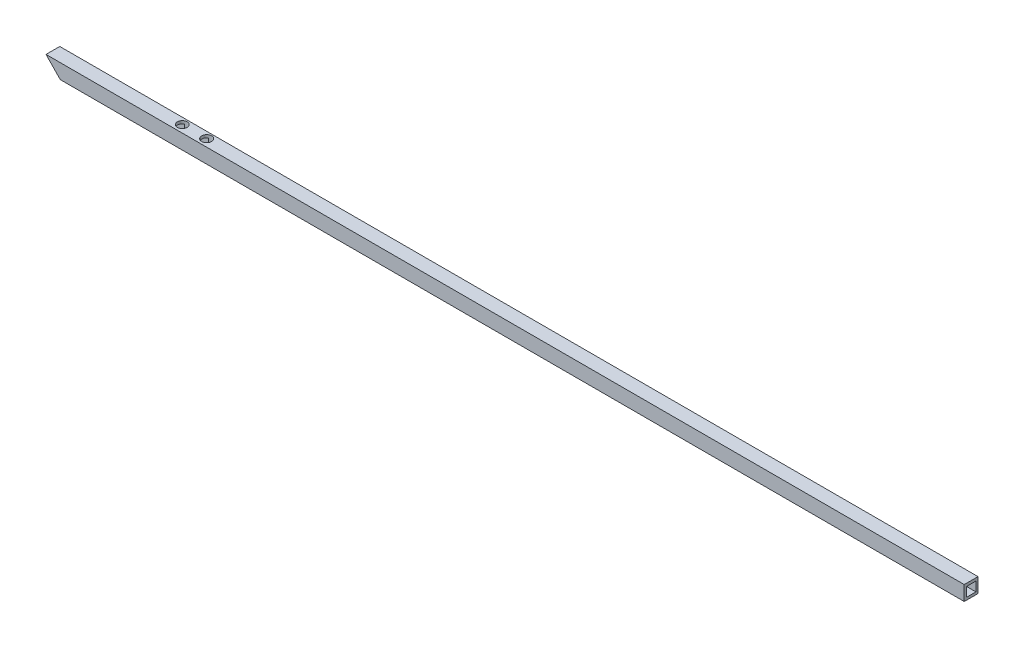
ISO-10303-21;
HEADER;
FILE_DESCRIPTION(('STEP AP214'),'2;1');
FILE_NAME('part.step','',(''),(''),'','','');
FILE_SCHEMA(('AUTOMOTIVE_DESIGN { 1 0 10303 214 1 1 1 1 }'));
ENDSEC;
DATA;
#1=APPLICATION_CONTEXT('core data for automotive mechanical design processes');
#2=APPLICATION_PROTOCOL_DEFINITION('international standard','automotive_design',2000,#1);
#3=PRODUCT_CONTEXT('',#1,'mechanical');
#4=PRODUCT('Part','Part','',(#3));
#5=PRODUCT_RELATED_PRODUCT_CATEGORY('part','',(#4));
#6=PRODUCT_DEFINITION_FORMATION('','',#4);
#7=PRODUCT_DEFINITION_CONTEXT('part definition',#1,'design');
#8=PRODUCT_DEFINITION('design','',#6,#7);
#9=PRODUCT_DEFINITION_SHAPE('','',#8);
#10=(LENGTH_UNIT() NAMED_UNIT(*) SI_UNIT(.MILLI.,.METRE.));
#11=(NAMED_UNIT(*) PLANE_ANGLE_UNIT() SI_UNIT($,.RADIAN.));
#12=(NAMED_UNIT(*) SI_UNIT($,.STERADIAN.) SOLID_ANGLE_UNIT());
#13=UNCERTAINTY_MEASURE_WITH_UNIT(LENGTH_MEASURE(1.E-05),#10,'distance_accuracy_value','');
#14=(GEOMETRIC_REPRESENTATION_CONTEXT(3) GLOBAL_UNCERTAINTY_ASSIGNED_CONTEXT((#13)) GLOBAL_UNIT_ASSIGNED_CONTEXT((#10,
#11,#12)) REPRESENTATION_CONTEXT('',''));
#15=CARTESIAN_POINT('',(0.,0.,0.));
#16=DIRECTION('',(0.,0.,1.));
#17=DIRECTION('',(1.,0.,0.));
#18=AXIS2_PLACEMENT_3D('',#15,#16,#17);
#19=CARTESIAN_POINT('',(-62.0552645668274,-8.14546996003816,7.62));
#20=DIRECTION('',(0.717580691628316,0.696475377168661,0.));
#21=DIRECTION('',(-0.696475377168661,0.717580691628316,0.));
#22=AXIS2_PLACEMENT_3D('',#19,#20,#21);
#23=PLANE('',#22);
#24=DIRECTION('',(0.,0.,1.));
#25=VECTOR('',#24,1.);
#26=CARTESIAN_POINT('',(-68.4516754726767,-1.55522842067826,7.62));
#27=LINE('',#26,#25);
#28=CARTESIAN_POINT('',(-68.4516754726767,-1.55522842067826,1.16287923693833));
#29=VERTEX_POINT('',#28);
#30=CARTESIAN_POINT('',(-68.4516754726767,-1.55522842067826,6.32744096741976));
#31=VERTEX_POINT('',#30);
#32=EDGE_CURVE('E247',#29,#31,#27,.T.);
#33=ORIENTED_EDGE('',*,*,#32,.T.);
#34=DIRECTION('',(0.696475377168661,-0.717580691628316,0.));
#35=VECTOR('',#34,1.);
#36=CARTESIAN_POINT('',(-62.0552645668274,-8.14546996003816,6.32744096741976));
#37=LINE('',#36,#35);
#38=CARTESIAN_POINT('',(-63.425501395985,-6.73371080272433,6.32744096741976));
#39=VERTEX_POINT('',#38);
#40=EDGE_CURVE('E251',#31,#39,#37,.T.);
#41=ORIENTED_EDGE('',*,*,#40,.T.);
#42=DIRECTION('',(0.,0.,-1.));
#43=VECTOR('',#42,1.);
#44=CARTESIAN_POINT('',(-63.425501395985,-6.73371080272433,7.62));
#45=LINE('',#44,#43);
#46=CARTESIAN_POINT('',(-63.425501395985,-6.73371080272433,1.16287923693833));
#47=VERTEX_POINT('',#46);
#48=EDGE_CURVE('E225',#39,#47,#45,.T.);
#49=ORIENTED_EDGE('',*,*,#48,.T.);
#50=DIRECTION('',(-0.696475377168661,0.717580691628316,0.));
#51=VECTOR('',#50,1.);
#52=CARTESIAN_POINT('',(-62.0552645668274,-8.14546996003816,1.16287923693833));
#53=LINE('',#52,#51);
#54=EDGE_CURVE('E243',#47,#29,#53,.T.);
#55=ORIENTED_EDGE('',*,*,#54,.T.);
#56=EDGE_LOOP('',(#33,#41,#49,#55));
#57=FACE_BOUND('',#56,.T.);
#58=DIRECTION('',(0.696475377168661,-0.717580691628315,0.));
#59=VECTOR('',#58,1.);
#60=CARTESIAN_POINT('',(-62.0552645668274,-8.14546996003816,0.));
#61=LINE('',#60,#59);
#62=CARTESIAN_POINT('',(-69.9611618809821,0.,0.));
#63=VERTEX_POINT('',#62);
#64=CARTESIAN_POINT('',(-62.0552645668274,-8.14546996003816,0.));
#65=VERTEX_POINT('',#64);
#66=EDGE_CURVE('E255',#63,#65,#61,.T.);
#67=ORIENTED_EDGE('',*,*,#66,.T.);
#68=DIRECTION('',(0.,0.,-1.));
#69=VECTOR('',#68,1.);
#70=CARTESIAN_POINT('',(-62.0552645668274,-8.14546996003816,7.62));
#71=LINE('',#70,#69);
#72=CARTESIAN_POINT('',(-62.0552645668274,-8.14546996003816,7.62));
#73=VERTEX_POINT('',#72);
#74=EDGE_CURVE('E293',#73,#65,#71,.T.);
#75=ORIENTED_EDGE('',*,*,#74,.F.);
#76=DIRECTION('',(0.696475377168661,-0.717580691628315,0.));
#77=VECTOR('',#76,1.);
#78=CARTESIAN_POINT('',(-62.0552645668274,-8.14546996003816,7.62));
#79=LINE('',#78,#77);
#80=CARTESIAN_POINT('',(-69.9611618809821,0.,7.62));
#81=VERTEX_POINT('',#80);
#82=EDGE_CURVE('E256',#81,#73,#79,.T.);
#83=ORIENTED_EDGE('',*,*,#82,.F.);
#84=DIRECTION('',(0.,0.,-1.));
#85=VECTOR('',#84,1.);
#86=CARTESIAN_POINT('',(-69.9611618809821,0.,7.62));
#87=LINE('',#86,#85);
#88=EDGE_CURVE('E270',#81,#63,#87,.T.);
#89=ORIENTED_EDGE('',*,*,#88,.T.);
#90=EDGE_LOOP('',(#67,#75,#83,#89));
#91=FACE_BOUND('',#90,.T.);
#92=ADVANCED_FACE('F38',(#57,#91),#23,.F.);
#93=CARTESIAN_POINT('',(438.038838119018,-8.1454699600381,7.62));
#94=DIRECTION('',(0.,1.,0.));
#95=DIRECTION('',(-1.,0.,0.));
#96=AXIS2_PLACEMENT_3D('',#93,#94,#95);
#97=PLANE('',#96);
#98=CARTESIAN_POINT('',(355.64213702936,-8.14546996003811,4.34554706149031));
#99=DIRECTION('',(0.,-1.,0.));
#100=DIRECTION('',(1.,0.,0.));
#101=AXIS2_PLACEMENT_3D('',#98,#99,#100);
#102=CIRCLE('',#101,2.27462414063635);
#103=CARTESIAN_POINT('',(357.916761169997,-8.14546996003811,4.34554706149031));
#104=VERTEX_POINT('',#103);
#105=EDGE_CURVE('E161',#104,#104,#102,.T.);
#106=ORIENTED_EDGE('',*,*,#105,.F.);
#107=EDGE_LOOP('',(#106));
#108=FACE_BOUND('',#107,.T.);
#109=CARTESIAN_POINT('',(368.018591586891,-8.14546996003811,4.34554706149031));
#110=DIRECTION('',(0.,-1.,0.));
#111=DIRECTION('',(1.,0.,0.));
#112=AXIS2_PLACEMENT_3D('',#109,#110,#111);
#113=CIRCLE('',#112,2.35533153052693);
#114=CARTESIAN_POINT('',(370.373923117418,-8.14546996003811,4.34554706149031));
#115=VERTEX_POINT('',#114);
#116=EDGE_CURVE('E162',#115,#115,#113,.T.);
#117=ORIENTED_EDGE('',*,*,#116,.F.);
#118=EDGE_LOOP('',(#117));
#119=FACE_BOUND('',#118,.T.);
#120=DIRECTION('',(1.,0.,0.));
#121=VECTOR('',#120,1.);
#122=CARTESIAN_POINT('',(438.038838119018,-8.1454699600381,0.));
#123=LINE('',#122,#121);
#124=CARTESIAN_POINT('',(438.038838119018,-8.1454699600381,0.));
#125=VERTEX_POINT('',#124);
#126=EDGE_CURVE('E274',#65,#125,#123,.T.);
#127=ORIENTED_EDGE('',*,*,#126,.T.);
#128=DIRECTION('',(0.,0.,-1.));
#129=VECTOR('',#128,1.);
#130=CARTESIAN_POINT('',(438.038838119018,-8.1454699600381,7.62));
#131=LINE('',#130,#129);
#132=CARTESIAN_POINT('',(438.038838119018,-8.1454699600381,7.62));
#133=VERTEX_POINT('',#132);
#134=EDGE_CURVE('E289',#133,#125,#131,.T.);
#135=ORIENTED_EDGE('',*,*,#134,.F.);
#136=DIRECTION('',(1.,0.,0.));
#137=VECTOR('',#136,1.);
#138=CARTESIAN_POINT('',(438.038838119018,-8.1454699600381,7.62));
#139=LINE('',#138,#137);
#140=EDGE_CURVE('E260',#73,#133,#139,.T.);
#141=ORIENTED_EDGE('',*,*,#140,.F.);
#142=ORIENTED_EDGE('',*,*,#74,.T.);
#143=EDGE_LOOP('',(#127,#135,#141,#142));
#144=FACE_BOUND('',#143,.T.);
#145=ADVANCED_FACE('F375',(#108,#119,#144),#97,.F.);
#146=CARTESIAN_POINT('',(438.038838119018,0.,7.62));
#147=DIRECTION('',(-1.,0.,0.));
#148=DIRECTION('',(0.,0.,1.));
#149=AXIS2_PLACEMENT_3D('',#146,#147,#148);
#150=PLANE('',#149);
#151=DIRECTION('',(0.,0.,-1.));
#152=VECTOR('',#151,1.);
#153=CARTESIAN_POINT('',(438.038838119018,-6.73371080272433,6.32744096741976));
#154=LINE('',#153,#152);
#155=CARTESIAN_POINT('',(438.038838119018,-6.73371080272433,6.32744096741976));
#156=VERTEX_POINT('',#155);
#157=CARTESIAN_POINT('',(438.038838119018,-6.73371080272433,1.16287923693833));
#158=VERTEX_POINT('',#157);
#159=EDGE_CURVE('E210',#156,#158,#154,.T.);
#160=ORIENTED_EDGE('',*,*,#159,.F.);
#161=DIRECTION('',(0.,-1.,0.));
#162=VECTOR('',#161,1.);
#163=CARTESIAN_POINT('',(438.038838119018,-1.55522842067826,6.32744096741976));
#164=LINE('',#163,#162);
#165=CARTESIAN_POINT('',(438.038838119018,-1.55522842067826,6.32744096741976));
#166=VERTEX_POINT('',#165);
#167=EDGE_CURVE('E207',#166,#156,#164,.T.);
#168=ORIENTED_EDGE('',*,*,#167,.F.);
#169=DIRECTION('',(0.,0.,1.));
#170=VECTOR('',#169,1.);
#171=CARTESIAN_POINT('',(438.038838119018,-1.55522842067826,6.32744096741976));
#172=LINE('',#171,#170);
#173=CARTESIAN_POINT('',(438.038838119018,-1.55522842067826,1.16287923693833));
#174=VERTEX_POINT('',#173);
#175=EDGE_CURVE('E218',#174,#166,#172,.T.);
#176=ORIENTED_EDGE('',*,*,#175,.F.);
#177=DIRECTION('',(0.,1.,0.));
#178=VECTOR('',#177,1.);
#179=CARTESIAN_POINT('',(438.038838119018,-1.55522842067826,1.16287923693833));
#180=LINE('',#179,#178);
#181=EDGE_CURVE('E214',#158,#174,#180,.T.);
#182=ORIENTED_EDGE('',*,*,#181,.F.);
#183=EDGE_LOOP('',(#160,#168,#176,#182));
#184=FACE_BOUND('',#183,.T.);
#185=DIRECTION('',(0.,1.,0.));
#186=VECTOR('',#185,1.);
#187=CARTESIAN_POINT('',(438.038838119018,0.,0.));
#188=LINE('',#187,#186);
#189=CARTESIAN_POINT('',(438.038838119018,0.,0.));
#190=VERTEX_POINT('',#189);
#191=EDGE_CURVE('E277',#125,#190,#188,.T.);
#192=ORIENTED_EDGE('',*,*,#191,.T.);
#193=DIRECTION('',(0.,0.,-1.));
#194=VECTOR('',#193,1.);
#195=CARTESIAN_POINT('',(438.038838119018,0.,7.62));
#196=LINE('',#195,#194);
#197=CARTESIAN_POINT('',(438.038838119018,0.,7.62));
#198=VERTEX_POINT('',#197);
#199=EDGE_CURVE('E285',#198,#190,#196,.T.);
#200=ORIENTED_EDGE('',*,*,#199,.F.);
#201=DIRECTION('',(0.,1.,0.));
#202=VECTOR('',#201,1.);
#203=CARTESIAN_POINT('',(438.038838119018,0.,7.62));
#204=LINE('',#203,#202);
#205=EDGE_CURVE('E264',#133,#198,#204,.T.);
#206=ORIENTED_EDGE('',*,*,#205,.F.);
#207=ORIENTED_EDGE('',*,*,#134,.T.);
#208=EDGE_LOOP('',(#192,#200,#206,#207));
#209=FACE_BOUND('',#208,.T.);
#210=ADVANCED_FACE('F336',(#184,#209),#150,.F.);
#211=CARTESIAN_POINT('',(-69.9611618809821,0.,7.62));
#212=DIRECTION('',(0.,-1.,0.));
#213=DIRECTION('',(0.,0.,-1.));
#214=AXIS2_PLACEMENT_3D('',#211,#212,#213);
#215=PLANE('',#214);
#216=CARTESIAN_POINT('',(1.36748307861712,0.,3.54632385434046));
#217=DIRECTION('',(0.,1.,0.));
#218=DIRECTION('',(0.,0.,1.));
#219=AXIS2_PLACEMENT_3D('',#216,#217,#218);
#220=CIRCLE('',#219,2.69540727056071);
#221=CARTESIAN_POINT('',(1.36748307861712,0.,6.24173112490116));
#222=VERTEX_POINT('',#221);
#223=EDGE_CURVE('E190',#222,#222,#220,.T.);
#224=ORIENTED_EDGE('',*,*,#223,.F.);
#225=EDGE_LOOP('',(#224));
#226=FACE_BOUND('',#225,.T.);
#227=CARTESIAN_POINT('',(14.8575847480799,0.,3.54632385434046));
#228=DIRECTION('',(0.,1.,0.));
#229=DIRECTION('',(0.,0.,1.));
#230=AXIS2_PLACEMENT_3D('',#227,#228,#229);
#231=CIRCLE('',#230,2.7478456385973);
#232=CARTESIAN_POINT('',(14.8575847480799,0.,6.29416949293776));
#233=VERTEX_POINT('',#232);
#234=EDGE_CURVE('E185',#233,#233,#231,.T.);
#235=ORIENTED_EDGE('',*,*,#234,.F.);
#236=EDGE_LOOP('',(#235));
#237=FACE_BOUND('',#236,.T.);
#238=DIRECTION('',(-1.,0.,0.));
#239=VECTOR('',#238,1.);
#240=CARTESIAN_POINT('',(-69.9611618809821,0.,0.));
#241=LINE('',#240,#239);
#242=EDGE_CURVE('E261',#190,#63,#241,.T.);
#243=ORIENTED_EDGE('',*,*,#242,.T.);
#244=ORIENTED_EDGE('',*,*,#88,.F.);
#245=DIRECTION('',(-1.,0.,0.));
#246=VECTOR('',#245,1.);
#247=CARTESIAN_POINT('',(-69.9611618809821,0.,7.62));
#248=LINE('',#247,#246);
#249=EDGE_CURVE('E267',#198,#81,#248,.T.);
#250=ORIENTED_EDGE('',*,*,#249,.F.);
#251=ORIENTED_EDGE('',*,*,#199,.T.);
#252=EDGE_LOOP('',(#243,#244,#250,#251));
#253=FACE_BOUND('',#252,.T.);
#254=ADVANCED_FACE('F383',(#226,#237,#253),#215,.F.);
#255=CARTESIAN_POINT('',(0.,0.,7.62));
#256=DIRECTION('',(0.,0.,-1.));
#257=DIRECTION('',(-1.,0.,0.));
#258=AXIS2_PLACEMENT_3D('',#255,#256,#257);
#259=PLANE('',#258);
#260=ORIENTED_EDGE('',*,*,#82,.T.);
#261=ORIENTED_EDGE('',*,*,#140,.T.);
#262=ORIENTED_EDGE('',*,*,#205,.T.);
#263=ORIENTED_EDGE('',*,*,#249,.T.);
#264=EDGE_LOOP('',(#260,#261,#262,#263));
#265=FACE_BOUND('',#264,.T.);
#266=ADVANCED_FACE('F390',(#265),#259,.F.);
#267=CARTESIAN_POINT('',(0.,0.,0.));
#268=DIRECTION('',(0.,0.,-1.));
#269=DIRECTION('',(-1.,0.,0.));
#270=AXIS2_PLACEMENT_3D('',#267,#268,#269);
#271=PLANE('',#270);
#272=ORIENTED_EDGE('',*,*,#66,.F.);
#273=ORIENTED_EDGE('',*,*,#242,.F.);
#274=ORIENTED_EDGE('',*,*,#191,.F.);
#275=ORIENTED_EDGE('',*,*,#126,.F.);
#276=EDGE_LOOP('',(#272,#273,#274,#275));
#277=FACE_BOUND('',#276,.T.);
#278=ADVANCED_FACE('F392',(#277),#271,.T.);
#279=CARTESIAN_POINT('',(-69.9611618809821,-1.55522842067826,6.32744096741976));
#280=DIRECTION('',(0.,0.,1.));
#281=DIRECTION('',(1.,0.,0.));
#282=AXIS2_PLACEMENT_3D('',#279,#280,#281);
#283=PLANE('',#282);
#284=DIRECTION('',(1.,0.,0.));
#285=VECTOR('',#284,1.);
#286=CARTESIAN_POINT('',(-69.9611618809821,-3.06546996003816,6.32744096741976));
#287=LINE('',#286,#285);
#288=CARTESIAN_POINT('',(354.52588816517,-3.06546996003811,6.32744096741976));
#289=VERTEX_POINT('',#288);
#290=CARTESIAN_POINT('',(356.75838589355,-3.06546996003811,6.32744096741976));
#291=VERTEX_POINT('',#290);
#292=EDGE_CURVE('E11',#289,#291,#287,.T.);
#293=ORIENTED_EDGE('',*,*,#292,.F.);
#294=DIRECTION('',(0.,-1.,0.));
#295=VECTOR('',#294,1.);
#296=CARTESIAN_POINT('',(354.52588816517,-3.06546996003811,6.32744096741976));
#297=LINE('',#296,#295);
#298=CARTESIAN_POINT('',(354.52588816517,-6.73371080272433,6.32744096741976));
#299=VERTEX_POINT('',#298);
#300=EDGE_CURVE('E181',#289,#299,#297,.T.);
#301=ORIENTED_EDGE('',*,*,#300,.T.);
#302=DIRECTION('',(1.,0.,0.));
#303=VECTOR('',#302,1.);
#304=CARTESIAN_POINT('',(-69.9611618809821,-6.73371080272433,6.32744096741976));
#305=LINE('',#304,#303);
#306=EDGE_CURVE('E235',#39,#299,#305,.T.);
#307=ORIENTED_EDGE('',*,*,#306,.F.);
#308=ORIENTED_EDGE('',*,*,#40,.F.);
#309=DIRECTION('',(1.,0.,0.));
#310=VECTOR('',#309,1.);
#311=CARTESIAN_POINT('',(-69.9611618809821,-1.55522842067826,6.32744096741976));
#312=LINE('',#311,#310);
#313=EDGE_CURVE('E222',#31,#166,#312,.T.);
#314=ORIENTED_EDGE('',*,*,#313,.T.);
#315=ORIENTED_EDGE('',*,*,#167,.T.);
#316=CARTESIAN_POINT('',(369.291259322136,-6.73371080272433,6.32744096741976));
#317=VERTEX_POINT('',#316);
#318=EDGE_CURVE('E168',#317,#156,#305,.T.);
#319=ORIENTED_EDGE('',*,*,#318,.F.);
#320=DIRECTION('',(0.,-1.,0.));
#321=VECTOR('',#320,1.);
#322=CARTESIAN_POINT('',(369.291259322136,-3.06546996003811,6.32744096741976));
#323=LINE('',#322,#321);
#324=CARTESIAN_POINT('',(369.291259322136,-3.06546996003811,6.32744096741976));
#325=VERTEX_POINT('',#324);
#326=EDGE_CURVE('E53',#317,#325,#323,.F.);
#327=ORIENTED_EDGE('',*,*,#326,.T.);
#328=DIRECTION('',(1.,0.,0.));
#329=VECTOR('',#328,1.);
#330=CARTESIAN_POINT('',(-69.9611618809821,-3.06546996003816,6.32744096741976));
#331=LINE('',#330,#329);
#332=CARTESIAN_POINT('',(366.745923851646,-3.06546996003811,6.32744096741976));
#333=VERTEX_POINT('',#332);
#334=EDGE_CURVE('E46',#333,#325,#331,.T.);
#335=ORIENTED_EDGE('',*,*,#334,.F.);
#336=DIRECTION('',(0.,-1.,0.));
#337=VECTOR('',#336,1.);
#338=CARTESIAN_POINT('',(366.745923851646,-3.06546996003811,6.32744096741976));
#339=LINE('',#338,#337);
#340=CARTESIAN_POINT('',(366.745923851646,-6.73371080272433,6.32744096741976));
#341=VERTEX_POINT('',#340);
#342=EDGE_CURVE('E159',#333,#341,#339,.T.);
#343=ORIENTED_EDGE('',*,*,#342,.T.);
#344=CARTESIAN_POINT('',(356.75838589355,-6.73371080272433,6.32744096741976));
#345=VERTEX_POINT('',#344);
#346=EDGE_CURVE('E239',#345,#341,#305,.T.);
#347=ORIENTED_EDGE('',*,*,#346,.F.);
#348=DIRECTION('',(0.,-1.,0.));
#349=VECTOR('',#348,1.);
#350=CARTESIAN_POINT('',(356.75838589355,-3.06546996003811,6.32744096741976));
#351=LINE('',#350,#349);
#352=EDGE_CURVE('E61',#345,#291,#351,.F.);
#353=ORIENTED_EDGE('',*,*,#352,.T.);
#354=EDGE_LOOP('',(#293,#301,#307,#308,#314,#315,#319,#327,#335,#343,#347,#353));
#355=FACE_BOUND('',#354,.T.);
#356=ADVANCED_FACE('F166',(#355),#283,.F.);
#357=CARTESIAN_POINT('',(-69.9611618809821,-1.55522842067826,6.32744096741976));
#358=DIRECTION('',(0.,1.,0.));
#359=DIRECTION('',(0.,0.,1.));
#360=AXIS2_PLACEMENT_3D('',#357,#358,#359);
#361=PLANE('',#360);
#362=DIRECTION('',(1.,0.,0.));
#363=VECTOR('',#362,1.);
#364=CARTESIAN_POINT('',(-69.9611618809821,-1.55522842067826,1.16287923693833));
#365=LINE('',#364,#363);
#366=CARTESIAN_POINT('',(0.108748750028128,-1.55522842067826,1.16287923693833));
#367=VERTEX_POINT('',#366);
#368=EDGE_CURVE('E226',#29,#367,#365,.T.);
#369=ORIENTED_EDGE('',*,*,#368,.T.);
#370=CARTESIAN_POINT('',(1.36748307861712,-1.55522842067826,3.54632385434046));
#371=DIRECTION('',(0.,1.,0.));
#372=DIRECTION('',(0.,0.,1.));
#373=AXIS2_PLACEMENT_3D('',#370,#371,#372);
#374=CIRCLE('',#373,2.69540727056071);
#375=CARTESIAN_POINT('',(2.6262174072061,-1.55522842067826,1.16287923693833));
#376=VERTEX_POINT('',#375);
#377=EDGE_CURVE('E203',#367,#376,#374,.T.);
#378=ORIENTED_EDGE('',*,*,#377,.T.);
#379=CARTESIAN_POINT('',(13.4901611087732,-1.55522842067826,1.16287923693833));
#380=VERTEX_POINT('',#379);
#381=EDGE_CURVE('E230',#376,#380,#365,.T.);
#382=ORIENTED_EDGE('',*,*,#381,.T.);
#383=CARTESIAN_POINT('',(14.8575847480799,-1.55522842067826,3.54632385434046));
#384=DIRECTION('',(0.,1.,0.));
#385=DIRECTION('',(0.,0.,1.));
#386=AXIS2_PLACEMENT_3D('',#383,#384,#385);
#387=CIRCLE('',#386,2.7478456385973);
#388=CARTESIAN_POINT('',(16.2250083873867,-1.55522842067826,1.16287923693833));
#389=VERTEX_POINT('',#388);
#390=EDGE_CURVE('E189',#380,#389,#387,.T.);
#391=ORIENTED_EDGE('',*,*,#390,.T.);
#392=EDGE_CURVE('E231',#389,#174,#365,.T.);
#393=ORIENTED_EDGE('',*,*,#392,.T.);
#394=ORIENTED_EDGE('',*,*,#175,.T.);
#395=ORIENTED_EDGE('',*,*,#313,.F.);
#396=ORIENTED_EDGE('',*,*,#32,.F.);
#397=EDGE_LOOP('',(#369,#378,#382,#391,#393,#394,#395,#396));
#398=FACE_BOUND('',#397,.T.);
#399=ADVANCED_FACE('F347',(#398),#361,.F.);
#400=CARTESIAN_POINT('',(-69.9611618809821,-1.55522842067826,1.16287923693833));
#401=DIRECTION('',(0.,0.,-1.));
#402=DIRECTION('',(-1.,0.,0.));
#403=AXIS2_PLACEMENT_3D('',#400,#401,#402);
#404=PLANE('',#403);
#405=DIRECTION('',(1.,0.,0.));
#406=VECTOR('',#405,1.);
#407=CARTESIAN_POINT('',(-69.9611618809821,-5.08,1.16287923693833));
#408=LINE('',#407,#406);
#409=CARTESIAN_POINT('',(0.108748750028128,-5.08,1.16287923693833));
#410=VERTEX_POINT('',#409);
#411=CARTESIAN_POINT('',(2.6262174072061,-5.08,1.16287923693833));
#412=VERTEX_POINT('',#411);
#413=EDGE_CURVE('E308',#410,#412,#408,.T.);
#414=ORIENTED_EDGE('',*,*,#413,.F.);
#415=DIRECTION('',(0.,1.,0.));
#416=VECTOR('',#415,1.);
#417=CARTESIAN_POINT('',(0.108748750028128,-5.08,1.16287923693833));
#418=LINE('',#417,#416);
#419=EDGE_CURVE('E315',#410,#367,#418,.T.);
#420=ORIENTED_EDGE('',*,*,#419,.T.);
#421=ORIENTED_EDGE('',*,*,#368,.F.);
#422=ORIENTED_EDGE('',*,*,#54,.F.);
#423=DIRECTION('',(1.,0.,0.));
#424=VECTOR('',#423,1.);
#425=CARTESIAN_POINT('',(-69.9611618809821,-6.73371080272433,1.16287923693833));
#426=LINE('',#425,#424);
#427=EDGE_CURVE('E232',#47,#158,#426,.T.);
#428=ORIENTED_EDGE('',*,*,#427,.T.);
#429=ORIENTED_EDGE('',*,*,#181,.T.);
#430=ORIENTED_EDGE('',*,*,#392,.F.);
#431=DIRECTION('',(0.,1.,0.));
#432=VECTOR('',#431,1.);
#433=CARTESIAN_POINT('',(16.2250083873867,-5.08,1.16287923693833));
#434=LINE('',#433,#432);
#435=CARTESIAN_POINT('',(16.2250083873867,-5.08,1.16287923693833));
#436=VERTEX_POINT('',#435);
#437=EDGE_CURVE('E300',#389,#436,#434,.F.);
#438=ORIENTED_EDGE('',*,*,#437,.T.);
#439=DIRECTION('',(1.,0.,0.));
#440=VECTOR('',#439,1.);
#441=CARTESIAN_POINT('',(-69.9611618809821,-5.08,1.16287923693833));
#442=LINE('',#441,#440);
#443=CARTESIAN_POINT('',(13.4901611087732,-5.08,1.16287923693833));
#444=VERTEX_POINT('',#443);
#445=EDGE_CURVE('E297',#444,#436,#442,.T.);
#446=ORIENTED_EDGE('',*,*,#445,.F.);
#447=DIRECTION('',(0.,1.,0.));
#448=VECTOR('',#447,1.);
#449=CARTESIAN_POINT('',(13.4901611087732,-5.08,1.16287923693833));
#450=LINE('',#449,#448);
#451=EDGE_CURVE('E304',#444,#380,#450,.T.);
#452=ORIENTED_EDGE('',*,*,#451,.T.);
#453=ORIENTED_EDGE('',*,*,#381,.F.);
#454=DIRECTION('',(0.,1.,0.));
#455=VECTOR('',#454,1.);
#456=CARTESIAN_POINT('',(2.6262174072061,-5.08,1.16287923693833));
#457=LINE('',#456,#455);
#458=EDGE_CURVE('E311',#376,#412,#457,.F.);
#459=ORIENTED_EDGE('',*,*,#458,.T.);
#460=EDGE_LOOP('',(#414,#420,#421,#422,#428,#429,#430,#438,#446,#452,#453,#459));
#461=FACE_BOUND('',#460,.T.);
#462=ADVANCED_FACE('F341',(#461),#404,.F.);
#463=CARTESIAN_POINT('',(-69.9611618809821,-6.73371080272433,6.32744096741976));
#464=DIRECTION('',(0.,-1.,0.));
#465=DIRECTION('',(0.,0.,-1.));
#466=AXIS2_PLACEMENT_3D('',#463,#464,#465);
#467=PLANE('',#466);
#468=ORIENTED_EDGE('',*,*,#306,.T.);
#469=CARTESIAN_POINT('',(355.64213702936,-6.73371080272433,4.34554706149031));
#470=DIRECTION('',(0.,-1.,0.));
#471=DIRECTION('',(0.,0.,-1.));
#472=AXIS2_PLACEMENT_3D('',#469,#470,#471);
#473=CIRCLE('',#472,2.27462414063635);
#474=EDGE_CURVE('E157',#299,#345,#473,.T.);
#475=ORIENTED_EDGE('',*,*,#474,.T.);
#476=ORIENTED_EDGE('',*,*,#346,.T.);
#477=CARTESIAN_POINT('',(368.018591586891,-6.73371080272433,4.34554706149031));
#478=DIRECTION('',(0.,-1.,0.));
#479=DIRECTION('',(0.,0.,-1.));
#480=AXIS2_PLACEMENT_3D('',#477,#478,#479);
#481=CIRCLE('',#480,2.35533153052693);
#482=EDGE_CURVE('E319',#341,#317,#481,.T.);
#483=ORIENTED_EDGE('',*,*,#482,.T.);
#484=ORIENTED_EDGE('',*,*,#318,.T.);
#485=ORIENTED_EDGE('',*,*,#159,.T.);
#486=ORIENTED_EDGE('',*,*,#427,.F.);
#487=ORIENTED_EDGE('',*,*,#48,.F.);
#488=EDGE_LOOP('',(#468,#475,#476,#483,#484,#485,#486,#487));
#489=FACE_BOUND('',#488,.T.);
#490=ADVANCED_FACE('F326',(#489),#467,.F.);
#491=CARTESIAN_POINT('',(14.8575847480799,-5.08,3.54632385434046));
#492=DIRECTION('',(0.,1.,0.));
#493=DIRECTION('',(0.,0.,1.));
#494=AXIS2_PLACEMENT_3D('',#491,#492,#493);
#495=CYLINDRICAL_SURFACE('',#494,2.7478456385973);
#496=ORIENTED_EDGE('',*,*,#234,.T.);
#497=EDGE_LOOP('',(#496));
#498=FACE_BOUND('',#497,.T.);
#499=CARTESIAN_POINT('',(14.8575847480799,-5.08,3.54632385434046));
#500=DIRECTION('',(0.,1.,0.));
#501=DIRECTION('',(0.,0.,1.));
#502=AXIS2_PLACEMENT_3D('',#499,#500,#501);
#503=CIRCLE('',#502,2.7478456385973);
#504=EDGE_CURVE('E194',#436,#444,#503,.T.);
#505=ORIENTED_EDGE('',*,*,#504,.F.);
#506=ORIENTED_EDGE('',*,*,#437,.F.);
#507=ORIENTED_EDGE('',*,*,#390,.F.);
#508=ORIENTED_EDGE('',*,*,#451,.F.);
#509=EDGE_LOOP('',(#505,#506,#507,#508));
#510=FACE_BOUND('',#509,.T.);
#511=ADVANCED_FACE('F360',(#498,#510),#495,.F.);
#512=CARTESIAN_POINT('',(14.8575847480799,-5.08,3.54632385434046));
#513=DIRECTION('',(0.,1.,0.));
#514=DIRECTION('',(0.,0.,1.));
#515=AXIS2_PLACEMENT_3D('',#512,#513,#514);
#516=PLANE('',#515);
#517=ORIENTED_EDGE('',*,*,#445,.T.);
#518=ORIENTED_EDGE('',*,*,#504,.T.);
#519=EDGE_LOOP('',(#517,#518));
#520=FACE_BOUND('',#519,.T.);
#521=ADVANCED_FACE('F362',(#520),#516,.T.);
#522=CARTESIAN_POINT('',(1.36748307861712,-5.08,3.54632385434046));
#523=DIRECTION('',(0.,1.,0.));
#524=DIRECTION('',(0.,0.,1.));
#525=AXIS2_PLACEMENT_3D('',#522,#523,#524);
#526=CYLINDRICAL_SURFACE('',#525,2.69540727056071);
#527=ORIENTED_EDGE('',*,*,#223,.T.);
#528=EDGE_LOOP('',(#527));
#529=FACE_BOUND('',#528,.T.);
#530=CARTESIAN_POINT('',(1.36748307861712,-5.08,3.54632385434046));
#531=DIRECTION('',(0.,1.,0.));
#532=DIRECTION('',(0.,0.,1.));
#533=AXIS2_PLACEMENT_3D('',#530,#531,#532);
#534=CIRCLE('',#533,2.69540727056071);
#535=EDGE_CURVE('E186',#412,#410,#534,.T.);
#536=ORIENTED_EDGE('',*,*,#535,.F.);
#537=ORIENTED_EDGE('',*,*,#458,.F.);
#538=ORIENTED_EDGE('',*,*,#377,.F.);
#539=ORIENTED_EDGE('',*,*,#419,.F.);
#540=EDGE_LOOP('',(#536,#537,#538,#539));
#541=FACE_BOUND('',#540,.T.);
#542=ADVANCED_FACE('F351',(#529,#541),#526,.F.);
#543=CARTESIAN_POINT('',(1.36748307861712,-5.08,3.54632385434046));
#544=DIRECTION('',(0.,1.,0.));
#545=DIRECTION('',(0.,0.,1.));
#546=AXIS2_PLACEMENT_3D('',#543,#544,#545);
#547=PLANE('',#546);
#548=ORIENTED_EDGE('',*,*,#413,.T.);
#549=ORIENTED_EDGE('',*,*,#535,.T.);
#550=EDGE_LOOP('',(#548,#549));
#551=FACE_BOUND('',#550,.T.);
#552=ADVANCED_FACE('F369',(#551),#547,.T.);
#553=CARTESIAN_POINT('',(368.018591586891,-3.06546996003811,4.34554706149031));
#554=DIRECTION('',(0.,-1.,0.));
#555=DIRECTION('',(1.,0.,0.));
#556=AXIS2_PLACEMENT_3D('',#553,#554,#555);
#557=PLANE('',#556);
#558=ORIENTED_EDGE('',*,*,#334,.T.);
#559=CARTESIAN_POINT('',(368.018591586891,-3.06546996003811,4.34554706149031));
#560=DIRECTION('',(0.,-1.,0.));
#561=DIRECTION('',(1.,0.,0.));
#562=AXIS2_PLACEMENT_3D('',#559,#560,#561);
#563=CIRCLE('',#562,2.35533153052693);
#564=EDGE_CURVE('E153',#325,#333,#563,.T.);
#565=ORIENTED_EDGE('',*,*,#564,.T.);
#566=EDGE_LOOP('',(#558,#565));
#567=FACE_BOUND('',#566,.T.);
#568=ADVANCED_FACE('F152',(#567),#557,.T.);
#569=CARTESIAN_POINT('',(368.018591586891,-3.06546996003811,4.34554706149031));
#570=DIRECTION('',(0.,-1.,0.));
#571=DIRECTION('',(1.,0.,0.));
#572=AXIS2_PLACEMENT_3D('',#569,#570,#571);
#573=CYLINDRICAL_SURFACE('',#572,2.35533153052693);
#574=ORIENTED_EDGE('',*,*,#116,.T.);
#575=EDGE_LOOP('',(#574));
#576=FACE_BOUND('',#575,.T.);
#577=ORIENTED_EDGE('',*,*,#564,.F.);
#578=ORIENTED_EDGE('',*,*,#326,.F.);
#579=ORIENTED_EDGE('',*,*,#482,.F.);
#580=ORIENTED_EDGE('',*,*,#342,.F.);
#581=EDGE_LOOP('',(#577,#578,#579,#580));
#582=FACE_BOUND('',#581,.T.);
#583=ADVANCED_FACE('F158',(#576,#582),#573,.F.);
#584=CARTESIAN_POINT('',(355.64213702936,-3.06546996003811,4.34554706149031));
#585=DIRECTION('',(0.,-1.,0.));
#586=DIRECTION('',(1.,0.,0.));
#587=AXIS2_PLACEMENT_3D('',#584,#585,#586);
#588=PLANE('',#587);
#589=ORIENTED_EDGE('',*,*,#292,.T.);
#590=CARTESIAN_POINT('',(355.64213702936,-3.06546996003811,4.34554706149031));
#591=DIRECTION('',(0.,-1.,0.));
#592=DIRECTION('',(1.,0.,0.));
#593=AXIS2_PLACEMENT_3D('',#590,#591,#592);
#594=CIRCLE('',#593,2.27462414063635);
#595=EDGE_CURVE('E170',#291,#289,#594,.T.);
#596=ORIENTED_EDGE('',*,*,#595,.T.);
#597=EDGE_LOOP('',(#589,#596));
#598=FACE_BOUND('',#597,.T.);
#599=ADVANCED_FACE('F497',(#598),#588,.T.);
#600=CARTESIAN_POINT('',(355.64213702936,-3.06546996003811,4.34554706149031));
#601=DIRECTION('',(0.,-1.,0.));
#602=DIRECTION('',(1.,0.,0.));
#603=AXIS2_PLACEMENT_3D('',#600,#601,#602);
#604=CYLINDRICAL_SURFACE('',#603,2.27462414063635);
#605=ORIENTED_EDGE('',*,*,#105,.T.);
#606=EDGE_LOOP('',(#605));
#607=FACE_BOUND('',#606,.T.);
#608=ORIENTED_EDGE('',*,*,#595,.F.);
#609=ORIENTED_EDGE('',*,*,#352,.F.);
#610=ORIENTED_EDGE('',*,*,#474,.F.);
#611=ORIENTED_EDGE('',*,*,#300,.F.);
#612=EDGE_LOOP('',(#608,#609,#610,#611));
#613=FACE_BOUND('',#612,.T.);
#614=ADVANCED_FACE('F505',(#607,#613),#604,.F.);
#615=CLOSED_SHELL('',(#92,#145,#210,#254,#266,#278,#356,#399,#462,#490,#511,#521,#542,#552,#568,
#583,#599,#614));
#616=MANIFOLD_SOLID_BREP('B2',#615);
#617=ADVANCED_BREP_SHAPE_REPRESENTATION('',(#18,#616),#14);
#618=SHAPE_DEFINITION_REPRESENTATION(#9,#617);
ENDSEC;
END-ISO-10303-21;
